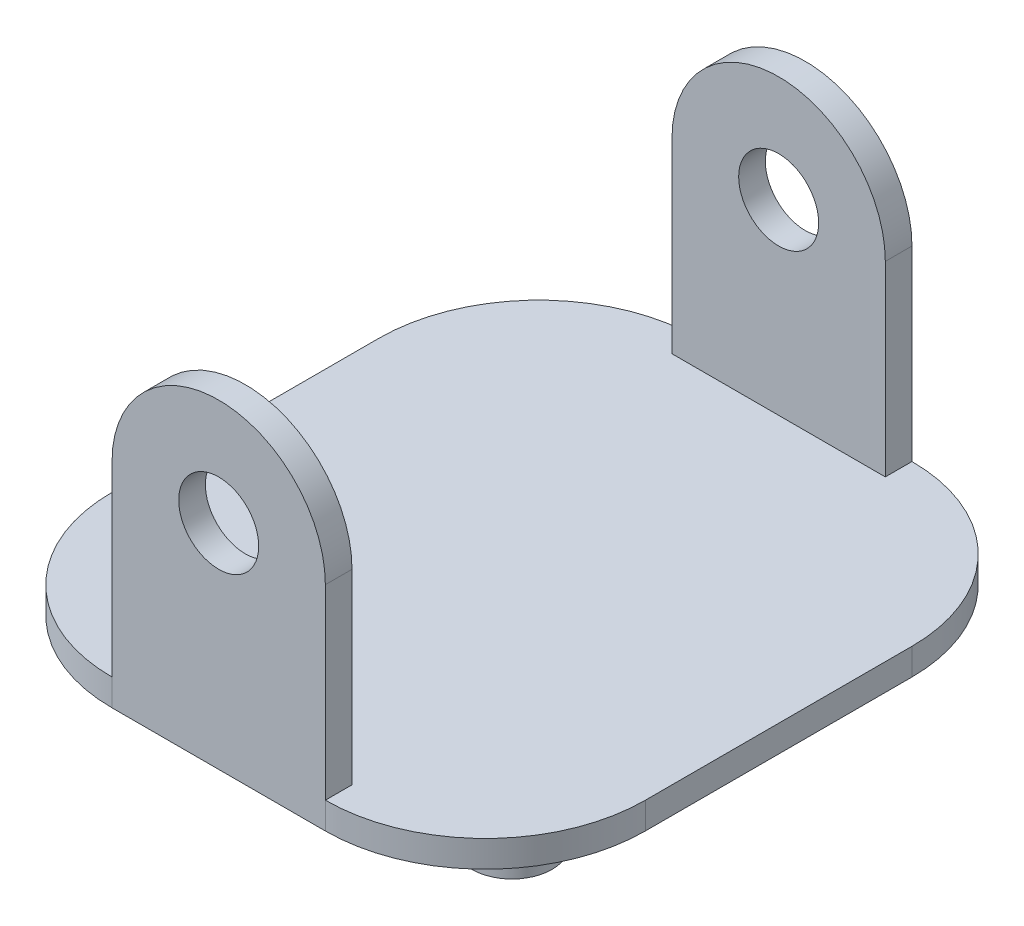
ISO-10303-21;
HEADER;
FILE_DESCRIPTION(('STEP AP214'),'2;1');
FILE_NAME('part.step','',(''),(''),'','','');
FILE_SCHEMA(('AUTOMOTIVE_DESIGN { 1 0 10303 214 1 1 1 1 }'));
ENDSEC;
DATA;
#1=APPLICATION_CONTEXT('core data for automotive mechanical design processes');
#2=APPLICATION_PROTOCOL_DEFINITION('international standard','automotive_design',2000,#1);
#3=PRODUCT_CONTEXT('',#1,'mechanical');
#4=PRODUCT('Part','Part','',(#3));
#5=PRODUCT_RELATED_PRODUCT_CATEGORY('part','',(#4));
#6=PRODUCT_DEFINITION_FORMATION('','',#4);
#7=PRODUCT_DEFINITION_CONTEXT('part definition',#1,'design');
#8=PRODUCT_DEFINITION('design','',#6,#7);
#9=PRODUCT_DEFINITION_SHAPE('','',#8);
#10=(LENGTH_UNIT() NAMED_UNIT(*) SI_UNIT(.MILLI.,.METRE.));
#11=(NAMED_UNIT(*) PLANE_ANGLE_UNIT() SI_UNIT($,.RADIAN.));
#12=(NAMED_UNIT(*) SI_UNIT($,.STERADIAN.) SOLID_ANGLE_UNIT());
#13=UNCERTAINTY_MEASURE_WITH_UNIT(LENGTH_MEASURE(1.E-05),#10,'distance_accuracy_value','');
#14=(GEOMETRIC_REPRESENTATION_CONTEXT(3) GLOBAL_UNCERTAINTY_ASSIGNED_CONTEXT((#13)) GLOBAL_UNIT_ASSIGNED_CONTEXT((#10,
#11,#12)) REPRESENTATION_CONTEXT('',''));
#15=CARTESIAN_POINT('',(0.,0.,0.));
#16=DIRECTION('',(0.,0.,1.));
#17=DIRECTION('',(1.,0.,0.));
#18=AXIS2_PLACEMENT_3D('',#15,#16,#17);
#19=CARTESIAN_POINT('',(0.,0.,0.));
#20=DIRECTION('',(0.,-1.,0.));
#21=DIRECTION('',(0.,0.,-1.));
#22=AXIS2_PLACEMENT_3D('',#19,#20,#21);
#23=PLANE('',#22);
#24=DIRECTION('',(0.,0.,1.));
#25=VECTOR('',#24,1.);
#26=CARTESIAN_POINT('',(-10.,0.,11.));
#27=LINE('',#26,#25);
#28=CARTESIAN_POINT('',(-10.,0.,-5.));
#29=VERTEX_POINT('',#28);
#30=CARTESIAN_POINT('',(-10.,0.,5.));
#31=VERTEX_POINT('',#30);
#32=EDGE_CURVE('E202',#29,#31,#27,.T.);
#33=ORIENTED_EDGE('',*,*,#32,.F.);
#34=CARTESIAN_POINT('',(-4.,0.,-5.));
#35=DIRECTION('',(0.,-1.,0.));
#36=DIRECTION('',(0.,0.,-1.));
#37=AXIS2_PLACEMENT_3D('',#34,#35,#36);
#38=CIRCLE('',#37,6.);
#39=CARTESIAN_POINT('',(-4.,0.,-11.));
#40=VERTEX_POINT('',#39);
#41=EDGE_CURVE('E265',#29,#40,#38,.T.);
#42=ORIENTED_EDGE('',*,*,#41,.T.);
#43=DIRECTION('',(-1.,0.,0.));
#44=VECTOR('',#43,1.);
#45=CARTESIAN_POINT('',(-10.,0.,-11.));
#46=LINE('',#45,#44);
#47=CARTESIAN_POINT('',(4.,0.,-11.));
#48=VERTEX_POINT('',#47);
#49=EDGE_CURVE('E205',#48,#40,#46,.T.);
#50=ORIENTED_EDGE('',*,*,#49,.F.);
#51=CARTESIAN_POINT('',(4.,0.,-5.));
#52=DIRECTION('',(0.,-1.,0.));
#53=DIRECTION('',(0.,0.,-1.));
#54=AXIS2_PLACEMENT_3D('',#51,#52,#53);
#55=CIRCLE('',#54,6.);
#56=CARTESIAN_POINT('',(10.,0.,-5.));
#57=VERTEX_POINT('',#56);
#58=EDGE_CURVE('E261',#48,#57,#55,.T.);
#59=ORIENTED_EDGE('',*,*,#58,.T.);
#60=DIRECTION('',(0.,0.,-1.));
#61=VECTOR('',#60,1.);
#62=CARTESIAN_POINT('',(10.,0.,11.));
#63=LINE('',#62,#61);
#64=CARTESIAN_POINT('',(10.,0.,5.));
#65=VERTEX_POINT('',#64);
#66=EDGE_CURVE('E207',#65,#57,#63,.T.);
#67=ORIENTED_EDGE('',*,*,#66,.F.);
#68=CARTESIAN_POINT('',(4.,0.,5.));
#69=DIRECTION('',(0.,-1.,0.));
#70=DIRECTION('',(0.,0.,-1.));
#71=AXIS2_PLACEMENT_3D('',#68,#69,#70);
#72=CIRCLE('',#71,6.);
#73=CARTESIAN_POINT('',(4.,0.,11.));
#74=VERTEX_POINT('',#73);
#75=EDGE_CURVE('E259',#65,#74,#72,.T.);
#76=ORIENTED_EDGE('',*,*,#75,.T.);
#77=DIRECTION('',(1.,0.,0.));
#78=VECTOR('',#77,1.);
#79=CARTESIAN_POINT('',(-10.,0.,11.));
#80=LINE('',#79,#78);
#81=CARTESIAN_POINT('',(-4.,0.,11.));
#82=VERTEX_POINT('',#81);
#83=EDGE_CURVE('E198',#82,#74,#80,.T.);
#84=ORIENTED_EDGE('',*,*,#83,.F.);
#85=CARTESIAN_POINT('',(-4.,0.,5.));
#86=DIRECTION('',(0.,-1.,0.));
#87=DIRECTION('',(0.,0.,-1.));
#88=AXIS2_PLACEMENT_3D('',#85,#86,#87);
#89=CIRCLE('',#88,6.);
#90=EDGE_CURVE('E263',#82,#31,#89,.T.);
#91=ORIENTED_EDGE('',*,*,#90,.T.);
#92=EDGE_LOOP('',(#33,#42,#50,#59,#67,#76,#84,#91));
#93=FACE_BOUND('',#92,.T.);
#94=CARTESIAN_POINT('',(0.,0.,0.));
#95=DIRECTION('',(0.,-1.,0.));
#96=DIRECTION('',(0.,0.,-1.));
#97=AXIS2_PLACEMENT_3D('',#94,#95,#96);
#98=CIRCLE('',#97,1.5);
#99=CARTESIAN_POINT('',(0.,0.,-1.5));
#100=VERTEX_POINT('',#99);
#101=EDGE_CURVE('E378',#100,#100,#98,.T.);
#102=ORIENTED_EDGE('',*,*,#101,.F.);
#103=EDGE_LOOP('',(#102));
#104=FACE_BOUND('',#103,.T.);
#105=ADVANCED_FACE('F33',(#93,#104),#23,.T.);
#106=CARTESIAN_POINT('',(0.,1.,0.));
#107=DIRECTION('',(0.,-1.,0.));
#108=DIRECTION('',(0.,0.,-1.));
#109=AXIS2_PLACEMENT_3D('',#106,#107,#108);
#110=PLANE('',#109);
#111=DIRECTION('',(0.,0.,1.));
#112=VECTOR('',#111,1.);
#113=CARTESIAN_POINT('',(-4.,1.,-11.));
#114=LINE('',#113,#112);
#115=CARTESIAN_POINT('',(-4.,1.,-11.));
#116=VERTEX_POINT('',#115);
#117=CARTESIAN_POINT('',(-4.,1.,-10.));
#118=VERTEX_POINT('',#117);
#119=EDGE_CURVE('E303',#116,#118,#114,.T.);
#120=ORIENTED_EDGE('',*,*,#119,.F.);
#121=CARTESIAN_POINT('',(-4.,1.,-5.));
#122=DIRECTION('',(0.,-1.,0.));
#123=DIRECTION('',(0.,0.,-1.));
#124=AXIS2_PLACEMENT_3D('',#121,#122,#123);
#125=CIRCLE('',#124,6.);
#126=CARTESIAN_POINT('',(-10.,1.,-5.));
#127=VERTEX_POINT('',#126);
#128=EDGE_CURVE('E242',#116,#127,#125,.F.);
#129=ORIENTED_EDGE('',*,*,#128,.T.);
#130=DIRECTION('',(0.,0.,1.));
#131=VECTOR('',#130,1.);
#132=CARTESIAN_POINT('',(-10.,1.,11.));
#133=LINE('',#132,#131);
#134=CARTESIAN_POINT('',(-10.,1.,5.));
#135=VERTEX_POINT('',#134);
#136=EDGE_CURVE('E209',#127,#135,#133,.T.);
#137=ORIENTED_EDGE('',*,*,#136,.T.);
#138=CARTESIAN_POINT('',(-4.,1.,5.));
#139=DIRECTION('',(0.,-1.,0.));
#140=DIRECTION('',(0.,0.,-1.));
#141=AXIS2_PLACEMENT_3D('',#138,#139,#140);
#142=CIRCLE('',#141,6.);
#143=CARTESIAN_POINT('',(-4.,1.,11.));
#144=VERTEX_POINT('',#143);
#145=EDGE_CURVE('E245',#135,#144,#142,.F.);
#146=ORIENTED_EDGE('',*,*,#145,.T.);
#147=DIRECTION('',(0.,0.,1.));
#148=VECTOR('',#147,1.);
#149=CARTESIAN_POINT('',(-4.,1.,11.));
#150=LINE('',#149,#148);
#151=CARTESIAN_POINT('',(-4.,1.,10.));
#152=VERTEX_POINT('',#151);
#153=EDGE_CURVE('E164',#152,#144,#150,.T.);
#154=ORIENTED_EDGE('',*,*,#153,.F.);
#155=DIRECTION('',(-1.,0.,0.));
#156=VECTOR('',#155,1.);
#157=CARTESIAN_POINT('',(-4.,1.,10.));
#158=LINE('',#157,#156);
#159=CARTESIAN_POINT('',(4.,1.,10.));
#160=VERTEX_POINT('',#159);
#161=EDGE_CURVE('E172',#160,#152,#158,.T.);
#162=ORIENTED_EDGE('',*,*,#161,.F.);
#163=DIRECTION('',(0.,0.,-1.));
#164=VECTOR('',#163,1.);
#165=CARTESIAN_POINT('',(4.,1.,10.));
#166=LINE('',#165,#164);
#167=CARTESIAN_POINT('',(4.,1.,11.));
#168=VERTEX_POINT('',#167);
#169=EDGE_CURVE('E178',#168,#160,#166,.T.);
#170=ORIENTED_EDGE('',*,*,#169,.F.);
#171=CARTESIAN_POINT('',(4.,1.,5.));
#172=DIRECTION('',(0.,-1.,0.));
#173=DIRECTION('',(0.,0.,-1.));
#174=AXIS2_PLACEMENT_3D('',#171,#172,#173);
#175=CIRCLE('',#174,6.);
#176=CARTESIAN_POINT('',(10.,1.,5.));
#177=VERTEX_POINT('',#176);
#178=EDGE_CURVE('E53',#168,#177,#175,.F.);
#179=ORIENTED_EDGE('',*,*,#178,.T.);
#180=DIRECTION('',(0.,0.,-1.));
#181=VECTOR('',#180,1.);
#182=CARTESIAN_POINT('',(10.,1.,11.));
#183=LINE('',#182,#181);
#184=CARTESIAN_POINT('',(10.,1.,-5.));
#185=VERTEX_POINT('',#184);
#186=EDGE_CURVE('E201',#177,#185,#183,.T.);
#187=ORIENTED_EDGE('',*,*,#186,.T.);
#188=CARTESIAN_POINT('',(4.,1.,-5.));
#189=DIRECTION('',(0.,-1.,0.));
#190=DIRECTION('',(0.,0.,-1.));
#191=AXIS2_PLACEMENT_3D('',#188,#189,#190);
#192=CIRCLE('',#191,6.);
#193=CARTESIAN_POINT('',(4.,1.,-11.));
#194=VERTEX_POINT('',#193);
#195=EDGE_CURVE('E277',#185,#194,#192,.F.);
#196=ORIENTED_EDGE('',*,*,#195,.T.);
#197=DIRECTION('',(0.,0.,-1.));
#198=VECTOR('',#197,1.);
#199=CARTESIAN_POINT('',(4.,1.,-10.));
#200=LINE('',#199,#198);
#201=CARTESIAN_POINT('',(4.,1.,-10.));
#202=VERTEX_POINT('',#201);
#203=EDGE_CURVE('E160',#202,#194,#200,.T.);
#204=ORIENTED_EDGE('',*,*,#203,.F.);
#205=DIRECTION('',(1.,0.,0.));
#206=VECTOR('',#205,1.);
#207=CARTESIAN_POINT('',(-4.,1.,-10.));
#208=LINE('',#207,#206);
#209=EDGE_CURVE('E301',#118,#202,#208,.T.);
#210=ORIENTED_EDGE('',*,*,#209,.F.);
#211=EDGE_LOOP('',(#120,#129,#137,#146,#154,#162,#170,#179,#187,#196,#204,#210));
#212=FACE_BOUND('',#211,.T.);
#213=ADVANCED_FACE('F226',(#212),#110,.F.);
#214=CARTESIAN_POINT('',(10.,1.,11.));
#215=DIRECTION('',(-1.,0.,0.));
#216=DIRECTION('',(0.,0.,1.));
#217=AXIS2_PLACEMENT_3D('',#214,#215,#216);
#218=PLANE('',#217);
#219=ORIENTED_EDGE('',*,*,#66,.T.);
#220=DIRECTION('',(0.,-1.,0.));
#221=VECTOR('',#220,1.);
#222=CARTESIAN_POINT('',(10.,1.,-5.));
#223=LINE('',#222,#221);
#224=EDGE_CURVE('E12',#57,#185,#223,.F.);
#225=ORIENTED_EDGE('',*,*,#224,.T.);
#226=ORIENTED_EDGE('',*,*,#186,.F.);
#227=DIRECTION('',(0.,-1.,0.));
#228=VECTOR('',#227,1.);
#229=CARTESIAN_POINT('',(10.,1.,5.));
#230=LINE('',#229,#228);
#231=EDGE_CURVE('E41',#177,#65,#230,.T.);
#232=ORIENTED_EDGE('',*,*,#231,.T.);
#233=EDGE_LOOP('',(#219,#225,#226,#232));
#234=FACE_BOUND('',#233,.T.);
#235=ADVANCED_FACE('F255',(#234),#218,.F.);
#236=CARTESIAN_POINT('',(-10.,1.,-11.));
#237=DIRECTION('',(0.,0.,1.));
#238=DIRECTION('',(1.,0.,0.));
#239=AXIS2_PLACEMENT_3D('',#236,#237,#238);
#240=PLANE('',#239);
#241=CARTESIAN_POINT('',(0.,8.,-11.));
#242=DIRECTION('',(0.,0.,1.));
#243=DIRECTION('',(1.,0.,0.));
#244=AXIS2_PLACEMENT_3D('',#241,#242,#243);
#245=CIRCLE('',#244,1.5);
#246=CARTESIAN_POINT('',(1.5,8.,-11.));
#247=VERTEX_POINT('',#246);
#248=EDGE_CURVE('E185',#247,#247,#245,.T.);
#249=ORIENTED_EDGE('',*,*,#248,.T.);
#250=EDGE_LOOP('',(#249));
#251=FACE_BOUND('',#250,.T.);
#252=ORIENTED_EDGE('',*,*,#49,.T.);
#253=DIRECTION('',(0.,-1.,0.));
#254=VECTOR('',#253,1.);
#255=CARTESIAN_POINT('',(-4.,1.,-11.));
#256=LINE('',#255,#254);
#257=EDGE_CURVE('E274',#40,#116,#256,.F.);
#258=ORIENTED_EDGE('',*,*,#257,.T.);
#259=DIRECTION('',(0.,-1.,0.));
#260=VECTOR('',#259,1.);
#261=CARTESIAN_POINT('',(-4.,21.,-11.));
#262=LINE('',#261,#260);
#263=CARTESIAN_POINT('',(-4.,8.,-11.));
#264=VERTEX_POINT('',#263);
#265=EDGE_CURVE('E155',#264,#116,#262,.T.);
#266=ORIENTED_EDGE('',*,*,#265,.F.);
#267=CARTESIAN_POINT('',(0.,8.,-11.));
#268=DIRECTION('',(0.,0.,-1.));
#269=DIRECTION('',(1.,0.,0.));
#270=AXIS2_PLACEMENT_3D('',#267,#268,#269);
#271=CIRCLE('',#270,4.);
#272=CARTESIAN_POINT('',(4.,8.,-11.));
#273=VERTEX_POINT('',#272);
#274=EDGE_CURVE('E136',#264,#273,#271,.T.);
#275=ORIENTED_EDGE('',*,*,#274,.T.);
#276=DIRECTION('',(0.,-1.,0.));
#277=VECTOR('',#276,1.);
#278=CARTESIAN_POINT('',(4.,21.,-11.));
#279=LINE('',#278,#277);
#280=EDGE_CURVE('E152',#273,#194,#279,.T.);
#281=ORIENTED_EDGE('',*,*,#280,.T.);
#282=DIRECTION('',(0.,-1.,0.));
#283=VECTOR('',#282,1.);
#284=CARTESIAN_POINT('',(4.,1.,-11.));
#285=LINE('',#284,#283);
#286=EDGE_CURVE('E272',#194,#48,#285,.T.);
#287=ORIENTED_EDGE('',*,*,#286,.T.);
#288=EDGE_LOOP('',(#252,#258,#266,#275,#281,#287));
#289=FACE_BOUND('',#288,.T.);
#290=ADVANCED_FACE('F150',(#251,#289),#240,.F.);
#291=CARTESIAN_POINT('',(-10.,1.,11.));
#292=DIRECTION('',(1.,0.,0.));
#293=DIRECTION('',(0.,0.,-1.));
#294=AXIS2_PLACEMENT_3D('',#291,#292,#293);
#295=PLANE('',#294);
#296=ORIENTED_EDGE('',*,*,#136,.F.);
#297=DIRECTION('',(0.,-1.,0.));
#298=VECTOR('',#297,1.);
#299=CARTESIAN_POINT('',(-10.,1.,-5.));
#300=LINE('',#299,#298);
#301=EDGE_CURVE('E267',#127,#29,#300,.T.);
#302=ORIENTED_EDGE('',*,*,#301,.T.);
#303=ORIENTED_EDGE('',*,*,#32,.T.);
#304=DIRECTION('',(0.,-1.,0.));
#305=VECTOR('',#304,1.);
#306=CARTESIAN_POINT('',(-10.,1.,5.));
#307=LINE('',#306,#305);
#308=EDGE_CURVE('E212',#31,#135,#307,.F.);
#309=ORIENTED_EDGE('',*,*,#308,.T.);
#310=EDGE_LOOP('',(#296,#302,#303,#309));
#311=FACE_BOUND('',#310,.T.);
#312=ADVANCED_FACE('F291',(#311),#295,.F.);
#313=CARTESIAN_POINT('',(-10.,1.,11.));
#314=DIRECTION('',(0.,0.,-1.));
#315=DIRECTION('',(-1.,0.,0.));
#316=AXIS2_PLACEMENT_3D('',#313,#314,#315);
#317=PLANE('',#316);
#318=CARTESIAN_POINT('',(0.,8.,11.));
#319=DIRECTION('',(0.,0.,1.));
#320=DIRECTION('',(1.,0.,0.));
#321=AXIS2_PLACEMENT_3D('',#318,#319,#320);
#322=CIRCLE('',#321,1.5);
#323=CARTESIAN_POINT('',(1.5,8.,11.));
#324=VERTEX_POINT('',#323);
#325=EDGE_CURVE('E322',#324,#324,#322,.T.);
#326=ORIENTED_EDGE('',*,*,#325,.F.);
#327=EDGE_LOOP('',(#326));
#328=FACE_BOUND('',#327,.T.);
#329=DIRECTION('',(0.,-1.,0.));
#330=VECTOR('',#329,1.);
#331=CARTESIAN_POINT('',(-4.,21.,11.));
#332=LINE('',#331,#330);
#333=CARTESIAN_POINT('',(-4.,8.,11.));
#334=VERTEX_POINT('',#333);
#335=EDGE_CURVE('E189',#334,#144,#332,.T.);
#336=ORIENTED_EDGE('',*,*,#335,.T.);
#337=DIRECTION('',(0.,-1.,0.));
#338=VECTOR('',#337,1.);
#339=CARTESIAN_POINT('',(-4.,1.,11.));
#340=LINE('',#339,#338);
#341=EDGE_CURVE('E241',#144,#82,#340,.T.);
#342=ORIENTED_EDGE('',*,*,#341,.T.);
#343=ORIENTED_EDGE('',*,*,#83,.T.);
#344=DIRECTION('',(0.,-1.,0.));
#345=VECTOR('',#344,1.);
#346=CARTESIAN_POINT('',(4.,1.,11.));
#347=LINE('',#346,#345);
#348=EDGE_CURVE('E237',#74,#168,#347,.F.);
#349=ORIENTED_EDGE('',*,*,#348,.T.);
#350=DIRECTION('',(0.,-1.,0.));
#351=VECTOR('',#350,1.);
#352=CARTESIAN_POINT('',(4.,21.,11.));
#353=LINE('',#352,#351);
#354=CARTESIAN_POINT('',(4.,8.,11.));
#355=VERTEX_POINT('',#354);
#356=EDGE_CURVE('E186',#355,#168,#353,.T.);
#357=ORIENTED_EDGE('',*,*,#356,.F.);
#358=CARTESIAN_POINT('',(0.,8.,11.));
#359=DIRECTION('',(0.,0.,-1.));
#360=DIRECTION('',(1.,0.,0.));
#361=AXIS2_PLACEMENT_3D('',#358,#359,#360);
#362=CIRCLE('',#361,4.);
#363=EDGE_CURVE('E156',#334,#355,#362,.T.);
#364=ORIENTED_EDGE('',*,*,#363,.F.);
#365=EDGE_LOOP('',(#336,#342,#343,#349,#357,#364));
#366=FACE_BOUND('',#365,.T.);
#367=ADVANCED_FACE('F234',(#328,#366),#317,.F.);
#368=CARTESIAN_POINT('',(-4.,21.,11.));
#369=DIRECTION('',(1.,0.,0.));
#370=DIRECTION('',(0.,0.,-1.));
#371=AXIS2_PLACEMENT_3D('',#368,#369,#370);
#372=PLANE('',#371);
#373=ORIENTED_EDGE('',*,*,#335,.F.);
#374=DIRECTION('',(0.,0.,1.));
#375=VECTOR('',#374,1.);
#376=CARTESIAN_POINT('',(-4.,8.,-11.));
#377=LINE('',#376,#375);
#378=CARTESIAN_POINT('',(-4.,8.,10.));
#379=VERTEX_POINT('',#378);
#380=EDGE_CURVE('E143',#379,#334,#377,.T.);
#381=ORIENTED_EDGE('',*,*,#380,.F.);
#382=DIRECTION('',(0.,-1.,0.));
#383=VECTOR('',#382,1.);
#384=CARTESIAN_POINT('',(-4.,21.,10.));
#385=LINE('',#384,#383);
#386=EDGE_CURVE('E214',#379,#152,#385,.T.);
#387=ORIENTED_EDGE('',*,*,#386,.T.);
#388=ORIENTED_EDGE('',*,*,#153,.T.);
#389=EDGE_LOOP('',(#373,#381,#387,#388));
#390=FACE_BOUND('',#389,.T.);
#391=ADVANCED_FACE('F287',(#390),#372,.F.);
#392=CARTESIAN_POINT('',(4.,21.,10.));
#393=DIRECTION('',(-1.,0.,0.));
#394=DIRECTION('',(0.,0.,1.));
#395=AXIS2_PLACEMENT_3D('',#392,#393,#394);
#396=PLANE('',#395);
#397=DIRECTION('',(0.,-1.,0.));
#398=VECTOR('',#397,1.);
#399=CARTESIAN_POINT('',(4.,21.,10.));
#400=LINE('',#399,#398);
#401=CARTESIAN_POINT('',(4.,8.,10.));
#402=VERTEX_POINT('',#401);
#403=EDGE_CURVE('E190',#402,#160,#400,.T.);
#404=ORIENTED_EDGE('',*,*,#403,.F.);
#405=DIRECTION('',(0.,0.,1.));
#406=VECTOR('',#405,1.);
#407=CARTESIAN_POINT('',(4.,8.,-11.));
#408=LINE('',#407,#406);
#409=EDGE_CURVE('E144',#402,#355,#408,.T.);
#410=ORIENTED_EDGE('',*,*,#409,.T.);
#411=ORIENTED_EDGE('',*,*,#356,.T.);
#412=ORIENTED_EDGE('',*,*,#169,.T.);
#413=EDGE_LOOP('',(#404,#410,#411,#412));
#414=FACE_BOUND('',#413,.T.);
#415=ADVANCED_FACE('F228',(#414),#396,.F.);
#416=CARTESIAN_POINT('',(-4.,21.,10.));
#417=DIRECTION('',(0.,0.,1.));
#418=DIRECTION('',(1.,0.,0.));
#419=AXIS2_PLACEMENT_3D('',#416,#417,#418);
#420=PLANE('',#419);
#421=CARTESIAN_POINT('',(0.,8.,10.));
#422=DIRECTION('',(0.,0.,1.));
#423=DIRECTION('',(1.,0.,0.));
#424=AXIS2_PLACEMENT_3D('',#421,#422,#423);
#425=CIRCLE('',#424,1.5);
#426=CARTESIAN_POINT('',(1.5,8.,10.));
#427=VERTEX_POINT('',#426);
#428=EDGE_CURVE('E184',#427,#427,#425,.T.);
#429=ORIENTED_EDGE('',*,*,#428,.T.);
#430=EDGE_LOOP('',(#429));
#431=FACE_BOUND('',#430,.T.);
#432=ORIENTED_EDGE('',*,*,#386,.F.);
#433=CARTESIAN_POINT('',(0.,8.,10.));
#434=DIRECTION('',(0.,0.,1.));
#435=DIRECTION('',(1.,0.,0.));
#436=AXIS2_PLACEMENT_3D('',#433,#434,#435);
#437=CIRCLE('',#436,4.);
#438=EDGE_CURVE('E317',#379,#402,#437,.F.);
#439=ORIENTED_EDGE('',*,*,#438,.T.);
#440=ORIENTED_EDGE('',*,*,#403,.T.);
#441=ORIENTED_EDGE('',*,*,#161,.T.);
#442=EDGE_LOOP('',(#432,#439,#440,#441));
#443=FACE_BOUND('',#442,.T.);
#444=ADVANCED_FACE('F222',(#431,#443),#420,.F.);
#445=CARTESIAN_POINT('',(-4.,21.,-10.));
#446=DIRECTION('',(0.,0.,-1.));
#447=DIRECTION('',(-1.,0.,0.));
#448=AXIS2_PLACEMENT_3D('',#445,#446,#447);
#449=PLANE('',#448);
#450=CARTESIAN_POINT('',(0.,8.,-10.));
#451=DIRECTION('',(0.,0.,-1.));
#452=DIRECTION('',(-1.,0.,0.));
#453=AXIS2_PLACEMENT_3D('',#450,#451,#452);
#454=CIRCLE('',#453,1.5);
#455=CARTESIAN_POINT('',(-1.5,8.,-10.));
#456=VERTEX_POINT('',#455);
#457=EDGE_CURVE('E181',#456,#456,#454,.T.);
#458=ORIENTED_EDGE('',*,*,#457,.T.);
#459=EDGE_LOOP('',(#458));
#460=FACE_BOUND('',#459,.T.);
#461=DIRECTION('',(0.,-1.,0.));
#462=VECTOR('',#461,1.);
#463=CARTESIAN_POINT('',(4.,21.,-10.));
#464=LINE('',#463,#462);
#465=CARTESIAN_POINT('',(4.,8.,-10.));
#466=VERTEX_POINT('',#465);
#467=EDGE_CURVE('E162',#466,#202,#464,.T.);
#468=ORIENTED_EDGE('',*,*,#467,.F.);
#469=CARTESIAN_POINT('',(0.,8.,-10.));
#470=DIRECTION('',(0.,0.,-1.));
#471=DIRECTION('',(-1.,0.,0.));
#472=AXIS2_PLACEMENT_3D('',#469,#470,#471);
#473=CIRCLE('',#472,4.);
#474=CARTESIAN_POINT('',(-4.,8.,-10.));
#475=VERTEX_POINT('',#474);
#476=EDGE_CURVE('E139',#466,#475,#473,.F.);
#477=ORIENTED_EDGE('',*,*,#476,.T.);
#478=DIRECTION('',(0.,-1.,0.));
#479=VECTOR('',#478,1.);
#480=CARTESIAN_POINT('',(-4.,21.,-10.));
#481=LINE('',#480,#479);
#482=EDGE_CURVE('E166',#475,#118,#481,.T.);
#483=ORIENTED_EDGE('',*,*,#482,.T.);
#484=ORIENTED_EDGE('',*,*,#209,.T.);
#485=EDGE_LOOP('',(#468,#477,#483,#484));
#486=FACE_BOUND('',#485,.T.);
#487=ADVANCED_FACE('F306',(#460,#486),#449,.F.);
#488=CARTESIAN_POINT('',(4.,21.,-10.));
#489=DIRECTION('',(-1.,0.,0.));
#490=DIRECTION('',(0.,0.,1.));
#491=AXIS2_PLACEMENT_3D('',#488,#489,#490);
#492=PLANE('',#491);
#493=ORIENTED_EDGE('',*,*,#280,.F.);
#494=EDGE_CURVE('E133',#273,#466,#408,.T.);
#495=ORIENTED_EDGE('',*,*,#494,.T.);
#496=ORIENTED_EDGE('',*,*,#467,.T.);
#497=ORIENTED_EDGE('',*,*,#203,.T.);
#498=EDGE_LOOP('',(#493,#495,#496,#497));
#499=FACE_BOUND('',#498,.T.);
#500=ADVANCED_FACE('F158',(#499),#492,.F.);
#501=CARTESIAN_POINT('',(-4.,21.,-11.));
#502=DIRECTION('',(1.,0.,0.));
#503=DIRECTION('',(0.,0.,-1.));
#504=AXIS2_PLACEMENT_3D('',#501,#502,#503);
#505=PLANE('',#504);
#506=ORIENTED_EDGE('',*,*,#482,.F.);
#507=EDGE_CURVE('E315',#264,#475,#377,.T.);
#508=ORIENTED_EDGE('',*,*,#507,.F.);
#509=ORIENTED_EDGE('',*,*,#265,.T.);
#510=ORIENTED_EDGE('',*,*,#119,.T.);
#511=EDGE_LOOP('',(#506,#508,#509,#510));
#512=FACE_BOUND('',#511,.T.);
#513=ADVANCED_FACE('F314',(#512),#505,.F.);
#514=CARTESIAN_POINT('',(0.,8.,-11.));
#515=DIRECTION('',(0.,0.,1.));
#516=DIRECTION('',(1.,0.,0.));
#517=AXIS2_PLACEMENT_3D('',#514,#515,#516);
#518=CYLINDRICAL_SURFACE('',#517,1.5);
#519=ORIENTED_EDGE('',*,*,#248,.F.);
#520=EDGE_LOOP('',(#519));
#521=FACE_BOUND('',#520,.T.);
#522=ORIENTED_EDGE('',*,*,#457,.F.);
#523=EDGE_LOOP('',(#522));
#524=FACE_BOUND('',#523,.T.);
#525=ADVANCED_FACE('F357',(#521,#524),#518,.F.);
#526=ORIENTED_EDGE('',*,*,#325,.T.);
#527=EDGE_LOOP('',(#526));
#528=FACE_BOUND('',#527,.T.);
#529=ORIENTED_EDGE('',*,*,#428,.F.);
#530=EDGE_LOOP('',(#529));
#531=FACE_BOUND('',#530,.T.);
#532=ADVANCED_FACE('F327',(#528,#531),#518,.F.);
#533=CARTESIAN_POINT('',(0.,8.,-11.));
#534=DIRECTION('',(0.,0.,1.));
#535=DIRECTION('',(1.,0.,0.));
#536=AXIS2_PLACEMENT_3D('',#533,#534,#535);
#537=CYLINDRICAL_SURFACE('',#536,4.);
#538=ORIENTED_EDGE('',*,*,#494,.F.);
#539=ORIENTED_EDGE('',*,*,#274,.F.);
#540=ORIENTED_EDGE('',*,*,#507,.T.);
#541=ORIENTED_EDGE('',*,*,#476,.F.);
#542=EDGE_LOOP('',(#538,#539,#540,#541));
#543=FACE_BOUND('',#542,.T.);
#544=ADVANCED_FACE('F135',(#543),#537,.T.);
#545=ORIENTED_EDGE('',*,*,#380,.T.);
#546=ORIENTED_EDGE('',*,*,#363,.T.);
#547=ORIENTED_EDGE('',*,*,#409,.F.);
#548=ORIENTED_EDGE('',*,*,#438,.F.);
#549=EDGE_LOOP('',(#545,#546,#547,#548));
#550=FACE_BOUND('',#549,.T.);
#551=ADVANCED_FACE('F360',(#550),#537,.T.);
#552=CARTESIAN_POINT('',(0.,-8.,0.));
#553=DIRECTION('',(0.,1.,0.));
#554=DIRECTION('',(0.,0.,1.));
#555=AXIS2_PLACEMENT_3D('',#552,#553,#554);
#556=CYLINDRICAL_SURFACE('',#555,1.5);
#557=CARTESIAN_POINT('',(0.,-8.,0.));
#558=DIRECTION('',(0.,-1.,0.));
#559=DIRECTION('',(0.,0.,-1.));
#560=AXIS2_PLACEMENT_3D('',#557,#558,#559);
#561=CIRCLE('',#560,1.5);
#562=CARTESIAN_POINT('',(0.,-8.,-1.5));
#563=VERTEX_POINT('',#562);
#564=EDGE_CURVE('E377',#563,#563,#561,.T.);
#565=ORIENTED_EDGE('',*,*,#564,.F.);
#566=EDGE_LOOP('',(#565));
#567=FACE_BOUND('',#566,.T.);
#568=ORIENTED_EDGE('',*,*,#101,.T.);
#569=EDGE_LOOP('',(#568));
#570=FACE_BOUND('',#569,.T.);
#571=ADVANCED_FACE('F363',(#567,#570),#556,.T.);
#572=CARTESIAN_POINT('',(0.,-8.,0.));
#573=DIRECTION('',(0.,-1.,0.));
#574=DIRECTION('',(0.,0.,-1.));
#575=AXIS2_PLACEMENT_3D('',#572,#573,#574);
#576=PLANE('',#575);
#577=ORIENTED_EDGE('',*,*,#564,.T.);
#578=EDGE_LOOP('',(#577));
#579=FACE_BOUND('',#578,.T.);
#580=ADVANCED_FACE('F367',(#579),#576,.T.);
#581=CARTESIAN_POINT('',(-4.,1.,-5.));
#582=DIRECTION('',(0.,-1.,0.));
#583=DIRECTION('',(0.,0.,-1.));
#584=AXIS2_PLACEMENT_3D('',#581,#582,#583);
#585=CYLINDRICAL_SURFACE('',#584,6.);
#586=ORIENTED_EDGE('',*,*,#128,.F.);
#587=ORIENTED_EDGE('',*,*,#257,.F.);
#588=ORIENTED_EDGE('',*,*,#41,.F.);
#589=ORIENTED_EDGE('',*,*,#301,.F.);
#590=EDGE_LOOP('',(#586,#587,#588,#589));
#591=FACE_BOUND('',#590,.T.);
#592=ADVANCED_FACE('F295',(#591),#585,.T.);
#593=CARTESIAN_POINT('',(-4.,1.,5.));
#594=DIRECTION('',(0.,-1.,0.));
#595=DIRECTION('',(0.,0.,-1.));
#596=AXIS2_PLACEMENT_3D('',#593,#594,#595);
#597=CYLINDRICAL_SURFACE('',#596,6.);
#598=ORIENTED_EDGE('',*,*,#145,.F.);
#599=ORIENTED_EDGE('',*,*,#308,.F.);
#600=ORIENTED_EDGE('',*,*,#90,.F.);
#601=ORIENTED_EDGE('',*,*,#341,.F.);
#602=EDGE_LOOP('',(#598,#599,#600,#601));
#603=FACE_BOUND('',#602,.T.);
#604=ADVANCED_FACE('F288',(#603),#597,.T.);
#605=CARTESIAN_POINT('',(4.,1.,-5.));
#606=DIRECTION('',(0.,-1.,0.));
#607=DIRECTION('',(0.,0.,-1.));
#608=AXIS2_PLACEMENT_3D('',#605,#606,#607);
#609=CYLINDRICAL_SURFACE('',#608,6.);
#610=ORIENTED_EDGE('',*,*,#195,.F.);
#611=ORIENTED_EDGE('',*,*,#224,.F.);
#612=ORIENTED_EDGE('',*,*,#58,.F.);
#613=ORIENTED_EDGE('',*,*,#286,.F.);
#614=EDGE_LOOP('',(#610,#611,#612,#613));
#615=FACE_BOUND('',#614,.T.);
#616=ADVANCED_FACE('F298',(#615),#609,.T.);
#617=CARTESIAN_POINT('',(4.,1.,5.));
#618=DIRECTION('',(0.,-1.,0.));
#619=DIRECTION('',(0.,0.,-1.));
#620=AXIS2_PLACEMENT_3D('',#617,#618,#619);
#621=CYLINDRICAL_SURFACE('',#620,6.);
#622=ORIENTED_EDGE('',*,*,#178,.F.);
#623=ORIENTED_EDGE('',*,*,#348,.F.);
#624=ORIENTED_EDGE('',*,*,#75,.F.);
#625=ORIENTED_EDGE('',*,*,#231,.F.);
#626=EDGE_LOOP('',(#622,#623,#624,#625));
#627=FACE_BOUND('',#626,.T.);
#628=ADVANCED_FACE('F35',(#627),#621,.T.);
#629=CLOSED_SHELL('',(#105,#213,#235,#290,#312,#367,#391,#415,#444,#487,#500,#513,#525,#532,
#544,#551,#571,#580,#592,#604,#616,#628));
#630=MANIFOLD_SOLID_BREP('B2',#629);
#631=ADVANCED_BREP_SHAPE_REPRESENTATION('',(#18,#630),#14);
#632=SHAPE_DEFINITION_REPRESENTATION(#9,#631);
ENDSEC;
END-ISO-10303-21;
